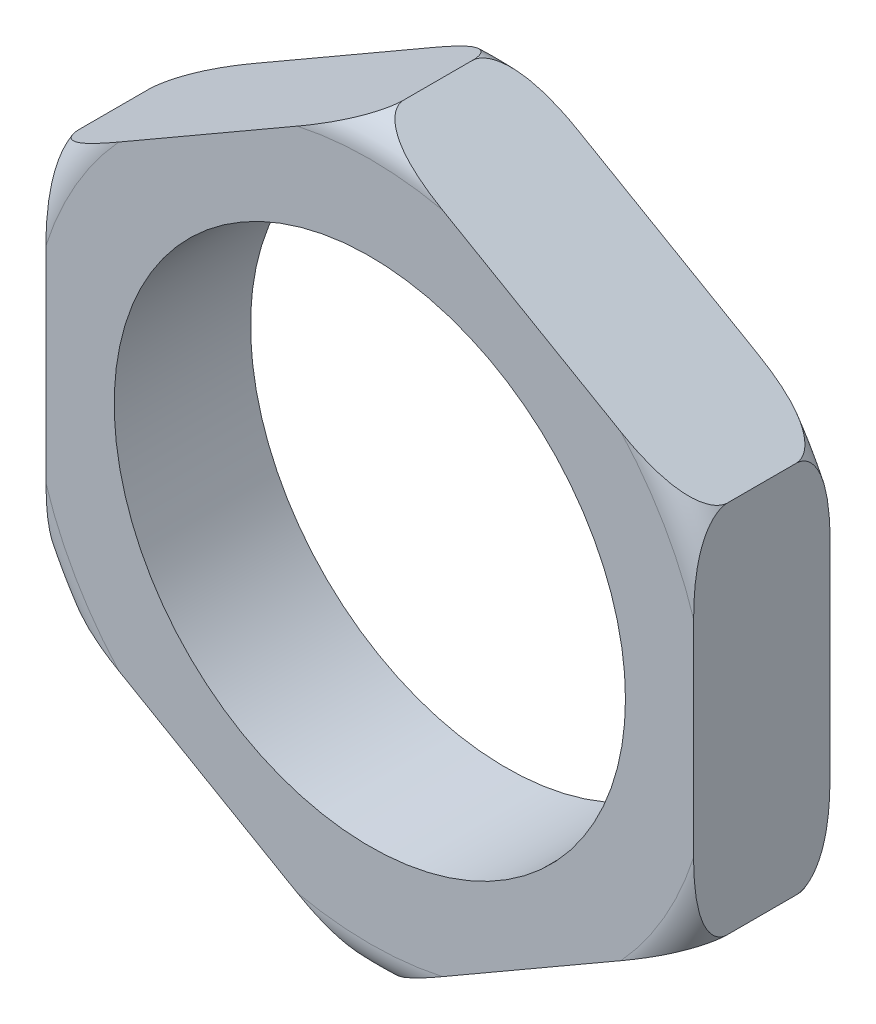
ISO-10303-21;
HEADER;
FILE_DESCRIPTION(('STEP AP214'),'2;1');
FILE_NAME('part.step','',(''),(''),'','','');
FILE_SCHEMA(('AUTOMOTIVE_DESIGN { 1 0 10303 214 1 1 1 1 }'));
ENDSEC;
DATA;
#1=APPLICATION_CONTEXT('core data for automotive mechanical design processes');
#2=APPLICATION_PROTOCOL_DEFINITION('international standard','automotive_design',2000,#1);
#3=PRODUCT_CONTEXT('',#1,'mechanical');
#4=PRODUCT('Part','Part','',(#3));
#5=PRODUCT_RELATED_PRODUCT_CATEGORY('part','',(#4));
#6=PRODUCT_DEFINITION_FORMATION('','',#4);
#7=PRODUCT_DEFINITION_CONTEXT('part definition',#1,'design');
#8=PRODUCT_DEFINITION('design','',#6,#7);
#9=PRODUCT_DEFINITION_SHAPE('','',#8);
#10=(LENGTH_UNIT() NAMED_UNIT(*) SI_UNIT(.MILLI.,.METRE.));
#11=(NAMED_UNIT(*) PLANE_ANGLE_UNIT() SI_UNIT($,.RADIAN.));
#12=(NAMED_UNIT(*) SI_UNIT($,.STERADIAN.) SOLID_ANGLE_UNIT());
#13=UNCERTAINTY_MEASURE_WITH_UNIT(LENGTH_MEASURE(1.E-05),#10,'distance_accuracy_value','');
#14=(GEOMETRIC_REPRESENTATION_CONTEXT(3) GLOBAL_UNCERTAINTY_ASSIGNED_CONTEXT((#13)) GLOBAL_UNIT_ASSIGNED_CONTEXT((#10,
#11,#12)) REPRESENTATION_CONTEXT('',''));
#15=CARTESIAN_POINT('',(0.,0.,0.));
#16=DIRECTION('',(0.,0.,1.));
#17=DIRECTION('',(1.,0.,0.));
#18=AXIS2_PLACEMENT_3D('',#15,#16,#17);
#19=CARTESIAN_POINT('',(0.,0.,15.5));
#20=DIRECTION('',(0.,0.,1.));
#21=DIRECTION('',(1.,0.,0.));
#22=AXIS2_PLACEMENT_3D('',#19,#20,#21);
#23=TOROIDAL_SURFACE('',#22,9.96965511460289,1.);
#24=CARTESIAN_POINT('',(9.5,3.02390858064981,14.5));
#25=CARTESIAN_POINT('',(9.5,3.88125681093695,14.5));
#26=CARTESIAN_POINT('',(9.5,4.44614894833069,14.6454097553584));
#27=CARTESIAN_POINT('',(9.5,4.84647059494945,14.7484571671493));
#28=CARTESIAN_POINT('',(9.5,5.10555316569901,14.9210536820706));
#29=CARTESIAN_POINT('',(9.5,5.27201082232685,15.0319450142541));
#30=CARTESIAN_POINT('',(9.5,5.36829139169409,15.1649452077994));
#31=CARTESIAN_POINT('',(9.5,5.48482755730145,15.3259261064653));
#32=CARTESIAN_POINT('',(9.5,5.48482755730145,15.5));
#33=B_SPLINE_CURVE_WITH_KNOTS('',2,(#24,#25,#26,#27,#28,#29,#30,#31,#32),.UNSPECIFIED.,.F.,.F.,
(3,2,2,2,3),(0.,0.5,0.75,0.875,1.),.UNSPECIFIED.);
#34=CARTESIAN_POINT('',(9.5,3.02390858064981,14.5));
#35=VERTEX_POINT('',#34);
#36=CARTESIAN_POINT('',(9.5,5.48482755730145,15.5));
#37=VERTEX_POINT('',#36);
#38=EDGE_CURVE('E506',#35,#37,#33,.T.);
#39=ORIENTED_EDGE('',*,*,#38,.F.);
#40=CARTESIAN_POINT('',(0.,0.,14.5));
#41=DIRECTION('',(0.,0.,1.));
#42=DIRECTION('',(1.,0.,0.));
#43=AXIS2_PLACEMENT_3D('',#40,#41,#42);
#44=CIRCLE('',#43,9.96965511460289);
#45=CARTESIAN_POINT('',(7.36878164956448,6.71528704562726,14.5));
#46=VERTEX_POINT('',#45);
#47=EDGE_CURVE('E651',#35,#46,#44,.T.);
#48=ORIENTED_EDGE('',*,*,#47,.T.);
#49=CARTESIAN_POINT('',(9.5,5.48482755730145,15.5));
#50=CARTESIAN_POINT('',(9.5,5.48482755730145,15.3253370413453));
#51=CARTESIAN_POINT('',(9.39786028269859,5.54379795058037,15.1630084843388));
#52=CARTESIAN_POINT('',(9.31453432809328,5.59190621290223,15.0305802543649));
#53=CARTESIAN_POINT('',(9.16885617377053,5.67601353451551,14.9189945151217));
#54=CARTESIAN_POINT('',(8.94447002387213,5.80556293856178,14.7471204648994));
#55=CARTESIAN_POINT('',(8.59618172343557,6.00664728257443,14.6441360537618));
#56=CARTESIAN_POINT('',(8.1087205568202,6.2880831183393,14.5));
#57=CARTESIAN_POINT('',(7.36878164956448,6.71528704562727,14.5));
#58=B_SPLINE_CURVE_WITH_KNOTS('',2,(#49,#50,#51,#52,#53,#54,#55,#56,#57),.UNSPECIFIED.,.F.,.F.,
(3,2,2,2,3),(0.,0.125,0.25,0.5,1.),.UNSPECIFIED.);
#59=EDGE_CURVE('E635',#37,#46,#58,.T.);
#60=ORIENTED_EDGE('',*,*,#59,.F.);
#61=EDGE_LOOP('',(#39,#48,#60));
#62=FACE_BOUND('',#61,.T.);
#63=ADVANCED_FACE('F16',(#62),#23,.T.);
#64=CARTESIAN_POINT('',(0.,0.,15.5));
#65=DIRECTION('',(0.,0.,1.));
#66=DIRECTION('',(1.,0.,0.));
#67=AXIS2_PLACEMENT_3D('',#64,#65,#66);
#68=TOROIDAL_SURFACE('',#67,9.96965511460289,1.);
#69=CARTESIAN_POINT('',(0.,0.,14.5));
#70=DIRECTION('',(0.,0.,1.));
#71=DIRECTION('',(1.,0.,0.));
#72=AXIS2_PLACEMENT_3D('',#69,#70,#71);
#73=CIRCLE('',#72,9.96965511460289);
#74=CARTESIAN_POINT('',(2.13121835043552,9.73919562627708,14.5));
#75=VERTEX_POINT('',#74);
#76=CARTESIAN_POINT('',(-2.13121835043552,9.73919562627708,14.5));
#77=VERTEX_POINT('',#76);
#78=EDGE_CURVE('E11',#75,#77,#73,.T.);
#79=ORIENTED_EDGE('',*,*,#78,.T.);
#80=CARTESIAN_POINT('',(0.,10.9696551146029,15.5));
#81=CARTESIAN_POINT('',(0.,10.9696551146029,15.3253370413446));
#82=CARTESIAN_POINT('',(-0.102139717301413,10.910684721324,15.1630084843389));
#83=CARTESIAN_POINT('',(-0.185465671907815,10.8625764590015,15.0305802543638));
#84=CARTESIAN_POINT('',(-0.331143826229461,10.7784691373888,14.9189945151217));
#85=CARTESIAN_POINT('',(-0.555529976128738,10.6489197333421,14.7471204648992));
#86=CARTESIAN_POINT('',(-0.903818276564435,10.4478353893299,14.6441360537618));
#87=CARTESIAN_POINT('',(-1.3912794431798,10.166399553565,14.5));
#88=CARTESIAN_POINT('',(-2.13121835043552,9.73919562627708,14.5));
#89=B_SPLINE_CURVE_WITH_KNOTS('',2,(#80,#81,#82,#83,#84,#85,#86,#87,#88),.UNSPECIFIED.,.F.,.F.,
(3,2,2,2,3),(0.,0.125,0.25,0.5,1.),.UNSPECIFIED.);
#90=CARTESIAN_POINT('',(0.,10.9696551146029,15.5));
#91=VERTEX_POINT('',#90);
#92=EDGE_CURVE('E207',#91,#77,#89,.T.);
#93=ORIENTED_EDGE('',*,*,#92,.F.);
#94=CARTESIAN_POINT('',(2.13121835043551,9.73919562627708,14.5));
#95=CARTESIAN_POINT('',(1.38867704383297,10.1679020495285,14.5));
#96=CARTESIAN_POINT('',(0.899457568548213,10.4503530452769,14.6454289384569));
#97=CARTESIAN_POINT('',(0.552712319350637,10.6505465082414,14.7485049525024));
#98=CARTESIAN_POINT('',(0.328351412116601,10.7800813384286,14.9211382569751));
#99=CARTESIAN_POINT('',(0.184382073950813,10.8632020745736,15.0319146970275));
#100=CARTESIAN_POINT('',(0.101063566289547,10.9113060374004,15.1647211909555));
#101=CARTESIAN_POINT('',(0.,10.9696551146029,15.3258126252541));
#102=CARTESIAN_POINT('',(0.,10.9696551146029,15.5));
#103=B_SPLINE_CURVE_WITH_KNOTS('',2,(#94,#95,#96,#97,#98,#99,#100,#101,#102),.UNSPECIFIED.,.F.,
.F.,(3,2,2,2,3),(0.,0.5,0.75,0.875,1.),.UNSPECIFIED.);
#104=EDGE_CURVE('E208',#75,#91,#103,.T.);
#105=ORIENTED_EDGE('',*,*,#104,.F.);
#106=EDGE_LOOP('',(#79,#93,#105));
#107=FACE_BOUND('',#106,.T.);
#108=ADVANCED_FACE('F203',(#107),#68,.T.);
#109=CARTESIAN_POINT('',(0.,0.,15.5));
#110=DIRECTION('',(0.,0.,1.));
#111=DIRECTION('',(1.,0.,0.));
#112=AXIS2_PLACEMENT_3D('',#109,#110,#111);
#113=TOROIDAL_SURFACE('',#112,9.96965511460289,1.);
#114=CARTESIAN_POINT('',(-7.36878164956449,6.71528704562727,14.5));
#115=CARTESIAN_POINT('',(-8.11132295616296,6.28658062237822,14.5));
#116=CARTESIAN_POINT('',(-8.60054243145179,6.00412962662741,14.6454289384569));
#117=CARTESIAN_POINT('',(-8.94728768064789,5.80393616366382,14.7485049525011));
#118=CARTESIAN_POINT('',(-9.17164858788341,5.67440133347576,14.9211382569751));
#119=CARTESIAN_POINT('',(-9.31561792604912,5.59128059733074,15.0319146970275));
#120=CARTESIAN_POINT('',(-9.39893643371045,5.54317663450399,15.1647211909555));
#121=CARTESIAN_POINT('',(-9.50000000000001,5.48482755730145,15.3258126252539));
#122=CARTESIAN_POINT('',(-9.50000000000001,5.48482755730145,15.5));
#123=B_SPLINE_CURVE_WITH_KNOTS('',2,(#114,#115,#116,#117,#118,#119,#120,#121,#122),
.UNSPECIFIED.,.F.,.F.,(3,2,2,2,3),(0.,0.5,0.75,0.875,1.),.UNSPECIFIED.);
#124=CARTESIAN_POINT('',(-7.36878164956448,6.71528704562726,14.5));
#125=VERTEX_POINT('',#124);
#126=CARTESIAN_POINT('',(-9.5,5.48482755730144,15.5));
#127=VERTEX_POINT('',#126);
#128=EDGE_CURVE('E219',#125,#127,#123,.T.);
#129=ORIENTED_EDGE('',*,*,#128,.F.);
#130=CARTESIAN_POINT('',(0.,0.,14.5));
#131=DIRECTION('',(0.,0.,1.));
#132=DIRECTION('',(1.,0.,0.));
#133=AXIS2_PLACEMENT_3D('',#130,#131,#132);
#134=CIRCLE('',#133,9.96965511460289);
#135=CARTESIAN_POINT('',(-9.5,3.0239085806498,14.5));
#136=VERTEX_POINT('',#135);
#137=EDGE_CURVE('E28',#125,#136,#134,.T.);
#138=ORIENTED_EDGE('',*,*,#137,.T.);
#139=CARTESIAN_POINT('',(-9.5,5.48482755730144,15.5));
#140=CARTESIAN_POINT('',(-9.5,5.48482755730144,15.3253112254228));
#141=CARTESIAN_POINT('',(-9.5,5.3668455599649,15.1629518571871));
#142=CARTESIAN_POINT('',(-9.5,5.27060561545487,15.0305125279466));
#143=CARTESIAN_POINT('',(-9.5,5.10232945936502,14.918910912195));
#144=CARTESIAN_POINT('',(-9.5,4.84280265604622,14.746791395953));
#145=CARTESIAN_POINT('',(-9.5,4.43979630969014,14.6437801842526));
#146=CARTESIAN_POINT('',(-9.5,3.87729126021449,14.5));
#147=CARTESIAN_POINT('',(-9.5,3.0239085806498,14.5));
#148=B_SPLINE_CURVE_WITH_KNOTS('',2,(#139,#140,#141,#142,#143,#144,#145,#146,#147),
.UNSPECIFIED.,.F.,.F.,(3,2,2,2,3),(0.,0.125,0.25,0.5,1.),.UNSPECIFIED.);
#149=EDGE_CURVE('E226',#127,#136,#148,.T.);
#150=ORIENTED_EDGE('',*,*,#149,.F.);
#151=EDGE_LOOP('',(#129,#138,#150));
#152=FACE_BOUND('',#151,.T.);
#153=ADVANCED_FACE('F281',(#152),#113,.T.);
#154=CARTESIAN_POINT('',(0.,0.,15.5));
#155=DIRECTION('',(0.,0.,1.));
#156=DIRECTION('',(1.,0.,0.));
#157=AXIS2_PLACEMENT_3D('',#154,#155,#156);
#158=TOROIDAL_SURFACE('',#157,9.96965511460289,1.);
#159=CARTESIAN_POINT('',(-9.5,-3.0239085806498,14.5));
#160=CARTESIAN_POINT('',(-9.5,-3.88125681093334,14.5));
#161=CARTESIAN_POINT('',(-9.5,-4.44614894833069,14.6454097553584));
#162=CARTESIAN_POINT('',(-9.5,-4.84647059494784,14.7484571671483));
#163=CARTESIAN_POINT('',(-9.5,-5.105553165699,14.9210536820706));
#164=CARTESIAN_POINT('',(-9.5,-5.27201082232438,15.0319450142524));
#165=CARTESIAN_POINT('',(-9.5,-5.3682913916941,15.1649452077994));
#166=CARTESIAN_POINT('',(-9.5,-5.48482755730144,15.3259261064632));
#167=CARTESIAN_POINT('',(-9.5,-5.48482755730144,15.5));
#168=B_SPLINE_CURVE_WITH_KNOTS('',2,(#159,#160,#161,#162,#163,#164,#165,#166,#167),
.UNSPECIFIED.,.F.,.F.,(3,2,2,2,3),(0.,0.5,0.75,0.875,1.),.UNSPECIFIED.);
#169=CARTESIAN_POINT('',(-9.5,-3.0239085806498,14.5));
#170=VERTEX_POINT('',#169);
#171=CARTESIAN_POINT('',(-9.5,-5.48482755730144,15.5));
#172=VERTEX_POINT('',#171);
#173=EDGE_CURVE('E311',#170,#172,#168,.T.);
#174=ORIENTED_EDGE('',*,*,#173,.F.);
#175=CARTESIAN_POINT('',(0.,0.,14.5));
#176=DIRECTION('',(0.,0.,1.));
#177=DIRECTION('',(1.,0.,0.));
#178=AXIS2_PLACEMENT_3D('',#175,#176,#177);
#179=CIRCLE('',#178,9.96965511460289);
#180=CARTESIAN_POINT('',(-7.36878164956448,-6.71528704562726,14.5));
#181=VERTEX_POINT('',#180);
#182=EDGE_CURVE('E397',#170,#181,#179,.T.);
#183=ORIENTED_EDGE('',*,*,#182,.T.);
#184=CARTESIAN_POINT('',(-9.5,-5.48482755730145,15.5));
#185=CARTESIAN_POINT('',(-9.5,-5.48482755730145,15.3253370413459));
#186=CARTESIAN_POINT('',(-9.39786028269858,-5.54379795058037,15.1630084843389));
#187=CARTESIAN_POINT('',(-9.31453432809358,-5.59190621290206,15.0305802543649));
#188=CARTESIAN_POINT('',(-9.16885617377054,-5.67601353451551,14.9189945151217));
#189=CARTESIAN_POINT('',(-8.94447002387042,-5.80556293856277,14.7471204648984));
#190=CARTESIAN_POINT('',(-8.59618172343557,-6.00664728257443,14.6441360537618));
#191=CARTESIAN_POINT('',(-8.10872055681786,-6.28808311834065,14.5));
#192=CARTESIAN_POINT('',(-7.36878164956448,-6.71528704562727,14.5));
#193=B_SPLINE_CURVE_WITH_KNOTS('',2,(#184,#185,#186,#187,#188,#189,#190,#191,#192),
.UNSPECIFIED.,.F.,.F.,(3,2,2,2,3),(0.,0.125,0.25,0.5,1.),.UNSPECIFIED.);
#194=EDGE_CURVE('E374',#172,#181,#193,.T.);
#195=ORIENTED_EDGE('',*,*,#194,.F.);
#196=EDGE_LOOP('',(#174,#183,#195));
#197=FACE_BOUND('',#196,.T.);
#198=ADVANCED_FACE('F291',(#197),#158,.T.);
#199=CARTESIAN_POINT('',(0.,0.,15.5));
#200=DIRECTION('',(0.,0.,1.));
#201=DIRECTION('',(1.,0.,0.));
#202=AXIS2_PLACEMENT_3D('',#199,#200,#201);
#203=TOROIDAL_SURFACE('',#202,9.96965511460289,1.);
#204=CARTESIAN_POINT('',(-2.13121835043551,-9.73919562627708,14.5));
#205=CARTESIAN_POINT('',(-1.3886770438338,-10.167902049528,14.5));
#206=CARTESIAN_POINT('',(-0.899457568548213,-10.4503530452769,14.6454289384569));
#207=CARTESIAN_POINT('',(-0.552712319351381,-10.650546508241,14.748504952502));
#208=CARTESIAN_POINT('',(-0.328351412116583,-10.7800813384286,14.9211382569751));
#209=CARTESIAN_POINT('',(-0.184382073951019,-10.8632020745735,15.0319146970272));
#210=CARTESIAN_POINT('',(-0.101063566289547,-10.9113060374004,15.1647211909555));
#211=CARTESIAN_POINT('',(0.,-10.9696551146029,15.325812625254));
#212=CARTESIAN_POINT('',(0.,-10.9696551146029,15.5));
#213=B_SPLINE_CURVE_WITH_KNOTS('',2,(#204,#205,#206,#207,#208,#209,#210,#211,#212),
.UNSPECIFIED.,.F.,.F.,(3,2,2,2,3),(0.,0.5,0.75,0.875,1.),.UNSPECIFIED.);
#214=CARTESIAN_POINT('',(-2.13121835043552,-9.73919562627708,14.5));
#215=VERTEX_POINT('',#214);
#216=CARTESIAN_POINT('',(0.,-10.9696551146029,15.5));
#217=VERTEX_POINT('',#216);
#218=EDGE_CURVE('E767',#215,#217,#213,.T.);
#219=ORIENTED_EDGE('',*,*,#218,.F.);
#220=CARTESIAN_POINT('',(0.,0.,14.5));
#221=DIRECTION('',(0.,0.,1.));
#222=DIRECTION('',(1.,0.,0.));
#223=AXIS2_PLACEMENT_3D('',#220,#221,#222);
#224=CIRCLE('',#223,9.96965511460289);
#225=CARTESIAN_POINT('',(2.13121835043551,-9.73919562627708,14.5));
#226=VERTEX_POINT('',#225);
#227=EDGE_CURVE('E754',#215,#226,#224,.T.);
#228=ORIENTED_EDGE('',*,*,#227,.T.);
#229=CARTESIAN_POINT('',(0.,-10.9696551146029,15.5));
#230=CARTESIAN_POINT('',(0.,-10.9696551146029,15.3253370413451));
#231=CARTESIAN_POINT('',(0.102139717301412,-10.910684721324,15.1630084843389));
#232=CARTESIAN_POINT('',(0.185465671906778,-10.8625764590021,15.030580254365));
#233=CARTESIAN_POINT('',(0.33114382622946,-10.7784691373888,14.9189945151217));
#234=CARTESIAN_POINT('',(0.555529976128196,-10.6489197333424,14.7471204648989));
#235=CARTESIAN_POINT('',(0.903818276564432,-10.4478353893299,14.6441360537618));
#236=CARTESIAN_POINT('',(1.39127944318193,-10.1663995535638,14.5));
#237=CARTESIAN_POINT('',(2.13121835043552,-9.73919562627708,14.5));
#238=B_SPLINE_CURVE_WITH_KNOTS('',2,(#229,#230,#231,#232,#233,#234,#235,#236,#237),
.UNSPECIFIED.,.F.,.F.,(3,2,2,2,3),(0.,0.125,0.25,0.5,1.),.UNSPECIFIED.);
#239=EDGE_CURVE('E784',#217,#226,#238,.T.);
#240=ORIENTED_EDGE('',*,*,#239,.F.);
#241=EDGE_LOOP('',(#219,#228,#240));
#242=FACE_BOUND('',#241,.T.);
#243=ADVANCED_FACE('F411',(#242),#203,.T.);
#244=CARTESIAN_POINT('',(0.,0.,15.5));
#245=DIRECTION('',(0.,0.,1.));
#246=DIRECTION('',(1.,0.,0.));
#247=AXIS2_PLACEMENT_3D('',#244,#245,#246);
#248=TOROIDAL_SURFACE('',#247,9.96965511460289,1.);
#249=CARTESIAN_POINT('',(7.36878164956448,-6.71528704562727,14.5));
#250=CARTESIAN_POINT('',(8.11132295616945,-6.28658062237448,14.5));
#251=CARTESIAN_POINT('',(8.60054243145179,-6.00412962662741,14.6454289384569));
#252=CARTESIAN_POINT('',(8.94728768064863,-5.80393616366339,14.7485049525027));
#253=CARTESIAN_POINT('',(9.17164858788341,-5.67440133347576,14.9211382569751));
#254=CARTESIAN_POINT('',(9.31561792604801,-5.59128059733138,15.031914697026));
#255=CARTESIAN_POINT('',(9.39893643371047,-5.54317663450398,15.1647211909555));
#256=CARTESIAN_POINT('',(9.50000000000001,-5.48482755730145,15.3258126252536));
#257=CARTESIAN_POINT('',(9.50000000000001,-5.48482755730145,15.5));
#258=B_SPLINE_CURVE_WITH_KNOTS('',2,(#249,#250,#251,#252,#253,#254,#255,#256,#257),
.UNSPECIFIED.,.F.,.F.,(3,2,2,2,3),(0.,0.5,0.75,0.875,1.),.UNSPECIFIED.);
#259=CARTESIAN_POINT('',(7.36878164956448,-6.71528704562726,14.5));
#260=VERTEX_POINT('',#259);
#261=CARTESIAN_POINT('',(9.5,-5.48482755730144,15.5));
#262=VERTEX_POINT('',#261);
#263=EDGE_CURVE('E474',#260,#262,#258,.T.);
#264=ORIENTED_EDGE('',*,*,#263,.F.);
#265=CARTESIAN_POINT('',(0.,0.,14.5));
#266=DIRECTION('',(0.,0.,1.));
#267=DIRECTION('',(1.,0.,0.));
#268=AXIS2_PLACEMENT_3D('',#265,#266,#267);
#269=CIRCLE('',#268,9.96965511460289);
#270=CARTESIAN_POINT('',(9.5,-3.02390858064981,14.5));
#271=VERTEX_POINT('',#270);
#272=EDGE_CURVE('E478',#260,#271,#269,.T.);
#273=ORIENTED_EDGE('',*,*,#272,.T.);
#274=CARTESIAN_POINT('',(9.5,-5.48482755730145,15.5));
#275=CARTESIAN_POINT('',(9.5,-5.48482755730145,15.3253112254239));
#276=CARTESIAN_POINT('',(9.5,-5.36684555996492,15.1629518571871));
#277=CARTESIAN_POINT('',(9.5,-5.27060561545521,15.0305125279462));
#278=CARTESIAN_POINT('',(9.5,-5.10232945936504,14.918910912195));
#279=CARTESIAN_POINT('',(9.5,-4.84280265604369,14.7467913959524));
#280=CARTESIAN_POINT('',(9.5,-4.43979630969014,14.6437801842526));
#281=CARTESIAN_POINT('',(9.5,-3.87729126021451,14.5));
#282=CARTESIAN_POINT('',(9.5,-3.02390858064982,14.5));
#283=B_SPLINE_CURVE_WITH_KNOTS('',2,(#274,#275,#276,#277,#278,#279,#280,#281,#282),
.UNSPECIFIED.,.F.,.F.,(3,2,2,2,3),(0.,0.125,0.25,0.5,1.),.UNSPECIFIED.);
#284=EDGE_CURVE('E873',#262,#271,#283,.T.);
#285=ORIENTED_EDGE('',*,*,#284,.F.);
#286=EDGE_LOOP('',(#264,#273,#285));
#287=FACE_BOUND('',#286,.T.);
#288=ADVANCED_FACE('F482',(#287),#248,.T.);
#289=CARTESIAN_POINT('',(0.,0.,17.5));
#290=DIRECTION('',(0.,0.,1.));
#291=DIRECTION('',(1.,0.,0.));
#292=AXIS2_PLACEMENT_3D('',#289,#290,#291);
#293=TOROIDAL_SURFACE('',#292,9.96965511460289,1.);
#294=CARTESIAN_POINT('',(0.,0.,18.5));
#295=DIRECTION('',(0.,0.,1.));
#296=DIRECTION('',(1.,0.,0.));
#297=AXIS2_PLACEMENT_3D('',#294,#295,#296);
#298=CIRCLE('',#297,9.96965511460289);
#299=CARTESIAN_POINT('',(9.5,3.02390858064981,18.5));
#300=VERTEX_POINT('',#299);
#301=CARTESIAN_POINT('',(7.36878164956448,6.71528704562726,18.5));
#302=VERTEX_POINT('',#301);
#303=EDGE_CURVE('E674',#300,#302,#298,.T.);
#304=ORIENTED_EDGE('',*,*,#303,.F.);
#305=CARTESIAN_POINT('',(9.5,5.48482755730145,17.5));
#306=CARTESIAN_POINT('',(9.5,5.48482755730145,17.6746887745774));
#307=CARTESIAN_POINT('',(9.5,5.36684555996491,17.8370481428129));
#308=CARTESIAN_POINT('',(9.5,5.27060561545459,17.9694874720535));
#309=CARTESIAN_POINT('',(9.5,5.10232945936503,18.081089087805));
#310=CARTESIAN_POINT('',(9.5,4.84280265604451,18.2532086040481));
#311=CARTESIAN_POINT('',(9.5,4.43979630969013,18.3562198157474));
#312=CARTESIAN_POINT('',(9.5,3.87729126021072,18.5));
#313=CARTESIAN_POINT('',(9.5,3.02390858064981,18.5));
#314=B_SPLINE_CURVE_WITH_KNOTS('',2,(#305,#306,#307,#308,#309,#310,#311,#312,#313),
.UNSPECIFIED.,.F.,.F.,(3,2,2,2,3),(0.,0.125,0.25,0.5,1.),.UNSPECIFIED.);
#315=CARTESIAN_POINT('',(9.5,5.48482755730145,17.5));
#316=VERTEX_POINT('',#315);
#317=EDGE_CURVE('E542',#316,#300,#314,.T.);
#318=ORIENTED_EDGE('',*,*,#317,.F.);
#319=CARTESIAN_POINT('',(7.36878164956448,6.71528704562727,18.5));
#320=CARTESIAN_POINT('',(8.11132295617668,6.2865806223703,18.5));
#321=CARTESIAN_POINT('',(8.60054243145178,6.00412962662741,18.3545710615431));
#322=CARTESIAN_POINT('',(8.94728768065096,5.80393616366204,18.2514950474951));
#323=CARTESIAN_POINT('',(9.1716485878834,5.67440133347576,18.0788617430249));
#324=CARTESIAN_POINT('',(9.31561792604907,5.59128059733076,17.9680853029734));
#325=CARTESIAN_POINT('',(9.39893643371046,5.54317663450398,17.8352788090445));
#326=CARTESIAN_POINT('',(9.5,5.48482755730145,17.674187374745));
#327=CARTESIAN_POINT('',(9.5,5.48482755730145,17.5));
#328=B_SPLINE_CURVE_WITH_KNOTS('',2,(#319,#320,#321,#322,#323,#324,#325,#326,#327),
.UNSPECIFIED.,.F.,.F.,(3,2,2,2,3),(0.,0.5,0.75,0.875,1.),.UNSPECIFIED.);
#329=EDGE_CURVE('E508',#302,#316,#328,.T.);
#330=ORIENTED_EDGE('',*,*,#329,.F.);
#331=EDGE_LOOP('',(#304,#318,#330));
#332=FACE_BOUND('',#331,.T.);
#333=ADVANCED_FACE('F486',(#332),#293,.T.);
#334=CARTESIAN_POINT('',(0.,0.,17.5));
#335=DIRECTION('',(0.,0.,1.));
#336=DIRECTION('',(1.,0.,0.));
#337=AXIS2_PLACEMENT_3D('',#334,#335,#336);
#338=TOROIDAL_SURFACE('',#337,9.96965511460289,1.);
#339=CARTESIAN_POINT('',(-2.13121835043552,9.73919562627708,18.5));
#340=CARTESIAN_POINT('',(-1.38867704382415,10.1679020495336,18.5));
#341=CARTESIAN_POINT('',(-0.899457568548217,10.4503530452769,18.3545710615431));
#342=CARTESIAN_POINT('',(-0.552712319349865,10.6505465082418,18.2514950474955));
#343=CARTESIAN_POINT('',(-0.328351412116588,10.7800813384286,18.0788617430249));
#344=CARTESIAN_POINT('',(-0.184382073952914,10.8632020745724,17.9680853029751));
#345=CARTESIAN_POINT('',(-0.101063566289545,10.9113060374004,17.8352788090445));
#346=CARTESIAN_POINT('',(0.,10.9696551146029,17.6741873747469));
#347=CARTESIAN_POINT('',(0.,10.9696551146029,17.5));
#348=B_SPLINE_CURVE_WITH_KNOTS('',2,(#339,#340,#341,#342,#343,#344,#345,#346,#347),
.UNSPECIFIED.,.F.,.F.,(3,2,2,2,3),(0.,0.5,0.75,0.875,1.),.UNSPECIFIED.);
#349=CARTESIAN_POINT('',(-2.13121835043552,9.73919562627708,18.5));
#350=VERTEX_POINT('',#349);
#351=CARTESIAN_POINT('',(0.,10.9696551146029,17.5));
#352=VERTEX_POINT('',#351);
#353=EDGE_CURVE('E675',#350,#352,#348,.T.);
#354=ORIENTED_EDGE('',*,*,#353,.F.);
#355=CARTESIAN_POINT('',(0.,0.,18.5));
#356=DIRECTION('',(0.,0.,1.));
#357=DIRECTION('',(1.,0.,0.));
#358=AXIS2_PLACEMENT_3D('',#355,#356,#357);
#359=CIRCLE('',#358,9.96965511460289);
#360=CARTESIAN_POINT('',(2.13121835043552,9.73919562627708,18.5));
#361=VERTEX_POINT('',#360);
#362=EDGE_CURVE('E44',#361,#350,#359,.T.);
#363=ORIENTED_EDGE('',*,*,#362,.F.);
#364=CARTESIAN_POINT('',(0.,10.9696551146029,17.5));
#365=CARTESIAN_POINT('',(0.,10.9696551146029,17.6746629586553));
#366=CARTESIAN_POINT('',(0.102139717301412,10.910684721324,17.8369915156611));
#367=CARTESIAN_POINT('',(0.185465671906138,10.8625764590024,17.9694197456337));
#368=CARTESIAN_POINT('',(0.331143826229462,10.7784691373888,18.0810054848783));
#369=CARTESIAN_POINT('',(0.555529976128063,10.6489197333424,18.2528795351023));
#370=CARTESIAN_POINT('',(0.90381827656443,10.4478353893299,18.3558639462382));
#371=CARTESIAN_POINT('',(1.39127944318768,10.1663995535605,18.5));
#372=CARTESIAN_POINT('',(2.13121835043551,9.73919562627708,18.5));
#373=B_SPLINE_CURVE_WITH_KNOTS('',2,(#364,#365,#366,#367,#368,#369,#370,#371,#372),
.UNSPECIFIED.,.F.,.F.,(3,2,2,2,3),(0.,0.125,0.25,0.5,1.),.UNSPECIFIED.);
#374=EDGE_CURVE('E588',#352,#361,#373,.T.);
#375=ORIENTED_EDGE('',*,*,#374,.F.);
#376=EDGE_LOOP('',(#354,#363,#375));
#377=FACE_BOUND('',#376,.T.);
#378=ADVANCED_FACE('F248',(#377),#338,.T.);
#379=CARTESIAN_POINT('',(0.,0.,17.5));
#380=DIRECTION('',(0.,0.,1.));
#381=DIRECTION('',(1.,0.,0.));
#382=AXIS2_PLACEMENT_3D('',#379,#380,#381);
#383=TOROIDAL_SURFACE('',#382,9.96965511460289,1.);
#384=CARTESIAN_POINT('',(0.,0.,18.5));
#385=DIRECTION('',(0.,0.,1.));
#386=DIRECTION('',(1.,0.,0.));
#387=AXIS2_PLACEMENT_3D('',#384,#385,#386);
#388=CIRCLE('',#387,9.96965511460289);
#389=CARTESIAN_POINT('',(-7.36878164956448,6.71528704562726,18.5));
#390=VERTEX_POINT('',#389);
#391=CARTESIAN_POINT('',(-9.5,3.0239085806498,18.5));
#392=VERTEX_POINT('',#391);
#393=EDGE_CURVE('E104',#390,#392,#388,.T.);
#394=ORIENTED_EDGE('',*,*,#393,.F.);
#395=CARTESIAN_POINT('',(-9.50000000000001,5.48482755730145,17.5));
#396=CARTESIAN_POINT('',(-9.50000000000001,5.48482755730145,17.6746629586538));
#397=CARTESIAN_POINT('',(-9.39786028269859,5.54379795058038,17.8369915156612));
#398=CARTESIAN_POINT('',(-9.3145343280953,5.59190621290107,17.9694197456326));
#399=CARTESIAN_POINT('',(-9.16885617377054,5.67601353451552,18.0810054848783));
#400=CARTESIAN_POINT('',(-8.94447002387485,5.80556293856022,18.2528795351001));
#401=CARTESIAN_POINT('',(-8.59618172343558,6.00664728257443,18.3558639462382));
#402=CARTESIAN_POINT('',(-8.10872055681875,6.28808311834014,18.5));
#403=CARTESIAN_POINT('',(-7.36878164956449,6.71528704562727,18.5));
#404=B_SPLINE_CURVE_WITH_KNOTS('',2,(#395,#396,#397,#398,#399,#400,#401,#402,#403),
.UNSPECIFIED.,.F.,.F.,(3,2,2,2,3),(0.,0.125,0.25,0.5,1.),.UNSPECIFIED.);
#405=CARTESIAN_POINT('',(-9.5,5.48482755730145,17.5));
#406=VERTEX_POINT('',#405);
#407=EDGE_CURVE('E685',#406,#390,#404,.T.);
#408=ORIENTED_EDGE('',*,*,#407,.F.);
#409=CARTESIAN_POINT('',(-9.5,3.0239085806498,18.5));
#410=CARTESIAN_POINT('',(-9.5,3.88125681094698,18.5));
#411=CARTESIAN_POINT('',(-9.5,4.44614894833069,18.3545902446416));
#412=CARTESIAN_POINT('',(-9.5,4.84647059495556,18.2515428328473));
#413=CARTESIAN_POINT('',(-9.5,5.10555316569901,18.0789463179294));
#414=CARTESIAN_POINT('',(-9.5,5.27201082232662,17.9680549857457));
#415=CARTESIAN_POINT('',(-9.5,5.3682913916941,17.8350547922006));
#416=CARTESIAN_POINT('',(-9.5,5.48482755730144,17.6740738935354));
#417=CARTESIAN_POINT('',(-9.5,5.48482755730144,17.5));
#418=B_SPLINE_CURVE_WITH_KNOTS('',2,(#409,#410,#411,#412,#413,#414,#415,#416,#417),
.UNSPECIFIED.,.F.,.F.,(3,2,2,2,3),(0.,0.5,0.75,0.875,1.),.UNSPECIFIED.);
#419=EDGE_CURVE('E321',#392,#406,#418,.T.);
#420=ORIENTED_EDGE('',*,*,#419,.F.);
#421=EDGE_LOOP('',(#394,#408,#420));
#422=FACE_BOUND('',#421,.T.);
#423=ADVANCED_FACE('F340',(#422),#383,.T.);
#424=CARTESIAN_POINT('',(0.,0.,17.5));
#425=DIRECTION('',(0.,0.,1.));
#426=DIRECTION('',(1.,0.,0.));
#427=AXIS2_PLACEMENT_3D('',#424,#425,#426);
#428=TOROIDAL_SURFACE('',#427,9.96965511460289,1.);
#429=CARTESIAN_POINT('',(0.,0.,18.5));
#430=DIRECTION('',(0.,0.,1.));
#431=DIRECTION('',(1.,0.,0.));
#432=AXIS2_PLACEMENT_3D('',#429,#430,#431);
#433=CIRCLE('',#432,9.96965511460289);
#434=CARTESIAN_POINT('',(-9.5,-3.0239085806498,18.5));
#435=VERTEX_POINT('',#434);
#436=CARTESIAN_POINT('',(-7.36878164956448,-6.71528704562726,18.5));
#437=VERTEX_POINT('',#436);
#438=EDGE_CURVE('E120',#435,#437,#433,.T.);
#439=ORIENTED_EDGE('',*,*,#438,.F.);
#440=CARTESIAN_POINT('',(-9.5,-5.48482755730144,17.5));
#441=CARTESIAN_POINT('',(-9.5,-5.48482755730144,17.6746887745774));
#442=CARTESIAN_POINT('',(-9.5,-5.36684555996492,17.8370481428129));
#443=CARTESIAN_POINT('',(-9.5,-5.27060561545272,17.9694874720561));
#444=CARTESIAN_POINT('',(-9.5,-5.10232945936502,18.081089087805));
#445=CARTESIAN_POINT('',(-9.5,-4.84280265604372,18.2532086040466));
#446=CARTESIAN_POINT('',(-9.5,-4.43979630969007,18.3562198157474));
#447=CARTESIAN_POINT('',(-9.5,-3.87729126022021,18.5));
#448=CARTESIAN_POINT('',(-9.5,-3.0239085806498,18.5));
#449=B_SPLINE_CURVE_WITH_KNOTS('',2,(#440,#441,#442,#443,#444,#445,#446,#447,#448),
.UNSPECIFIED.,.F.,.F.,(3,2,2,2,3),(0.,0.125,0.25,0.5,1.),.UNSPECIFIED.);
#450=CARTESIAN_POINT('',(-9.5,-5.48482755730144,17.5));
#451=VERTEX_POINT('',#450);
#452=EDGE_CURVE('E361',#451,#435,#449,.T.);
#453=ORIENTED_EDGE('',*,*,#452,.F.);
#454=CARTESIAN_POINT('',(-7.36878164956448,-6.71528704562727,18.5));
#455=CARTESIAN_POINT('',(-8.11132295616828,-6.28658062237515,18.5));
#456=CARTESIAN_POINT('',(-8.60054243145178,-6.00412962662741,18.3545710615431));
#457=CARTESIAN_POINT('',(-8.94728768064544,-5.80393616366523,18.2514950474985));
#458=CARTESIAN_POINT('',(-9.17164858788341,-5.67440133347576,18.0788617430249));
#459=CARTESIAN_POINT('',(-9.31561792604857,-5.59128059733105,17.9680853029744));
#460=CARTESIAN_POINT('',(-9.39893643371045,-5.54317663450398,17.8352788090445));
#461=CARTESIAN_POINT('',(-9.5,-5.48482755730145,17.6741873747449));
#462=CARTESIAN_POINT('',(-9.5,-5.48482755730145,17.5));
#463=B_SPLINE_CURVE_WITH_KNOTS('',2,(#454,#455,#456,#457,#458,#459,#460,#461,#462),
.UNSPECIFIED.,.F.,.F.,(3,2,2,2,3),(0.,0.5,0.75,0.875,1.),.UNSPECIFIED.);
#464=EDGE_CURVE('E313',#437,#451,#463,.T.);
#465=ORIENTED_EDGE('',*,*,#464,.F.);
#466=EDGE_LOOP('',(#439,#453,#465));
#467=FACE_BOUND('',#466,.T.);
#468=ADVANCED_FACE('F18',(#467),#428,.T.);
#469=CARTESIAN_POINT('',(0.,0.,17.5));
#470=DIRECTION('',(0.,0.,1.));
#471=DIRECTION('',(1.,0.,0.));
#472=AXIS2_PLACEMENT_3D('',#469,#470,#471);
#473=TOROIDAL_SURFACE('',#472,9.96965511460289,1.);
#474=CARTESIAN_POINT('',(0.,0.,18.5));
#475=DIRECTION('',(0.,0.,1.));
#476=DIRECTION('',(1.,0.,0.));
#477=AXIS2_PLACEMENT_3D('',#474,#475,#476);
#478=CIRCLE('',#477,9.96965511460289);
#479=CARTESIAN_POINT('',(-2.13121835043552,-9.73919562627708,18.5));
#480=VERTEX_POINT('',#479);
#481=CARTESIAN_POINT('',(2.13121835043551,-9.73919562627708,18.5));
#482=VERTEX_POINT('',#481);
#483=EDGE_CURVE('E381',#480,#482,#478,.T.);
#484=ORIENTED_EDGE('',*,*,#483,.F.);
#485=CARTESIAN_POINT('',(0.,-10.9696551146029,17.5));
#486=CARTESIAN_POINT('',(0.,-10.9696551146029,17.6746629586553));
#487=CARTESIAN_POINT('',(-0.102139717301412,-10.910684721324,17.8369915156612));
#488=CARTESIAN_POINT('',(-0.18546567190586,-10.8625764590026,17.9694197456332));
#489=CARTESIAN_POINT('',(-0.331143826229462,-10.7784691373888,18.0810054848783));
#490=CARTESIAN_POINT('',(-0.555529976126208,-10.6489197333435,18.2528795351012));
#491=CARTESIAN_POINT('',(-0.90381827656443,-10.4478353893299,18.3558639462382));
#492=CARTESIAN_POINT('',(-1.39127944318514,-10.166399553562,18.5));
#493=CARTESIAN_POINT('',(-2.13121835043551,-9.73919562627708,18.5));
#494=B_SPLINE_CURVE_WITH_KNOTS('',2,(#485,#486,#487,#488,#489,#490,#491,#492,#493),
.UNSPECIFIED.,.F.,.F.,(3,2,2,2,3),(0.,0.125,0.25,0.5,1.),.UNSPECIFIED.);
#495=CARTESIAN_POINT('',(0.,-10.9696551146029,17.5));
#496=VERTEX_POINT('',#495);
#497=EDGE_CURVE('E764',#496,#480,#494,.T.);
#498=ORIENTED_EDGE('',*,*,#497,.F.);
#499=CARTESIAN_POINT('',(2.13121835043552,-9.73919562627708,18.5));
#500=CARTESIAN_POINT('',(1.38867704382446,-10.1679020495334,18.5));
#501=CARTESIAN_POINT('',(0.89945756854821,-10.4503530452769,18.3545710615431));
#502=CARTESIAN_POINT('',(0.552712319348176,-10.6505465082428,18.2514950474951));
#503=CARTESIAN_POINT('',(0.328351412116582,-10.7800813384286,18.0788617430249));
#504=CARTESIAN_POINT('',(0.184382073950302,-10.8632020745739,17.9680853029725));
#505=CARTESIAN_POINT('',(0.101063566289543,-10.9113060374004,17.8352788090445));
#506=CARTESIAN_POINT('',(0.,-10.9696551146029,17.6741873747449));
#507=CARTESIAN_POINT('',(0.,-10.9696551146029,17.5));
#508=B_SPLINE_CURVE_WITH_KNOTS('',2,(#499,#500,#501,#502,#503,#504,#505,#506,#507),
.UNSPECIFIED.,.F.,.F.,(3,2,2,2,3),(0.,0.5,0.75,0.875,1.),.UNSPECIFIED.);
#509=EDGE_CURVE('E377',#482,#496,#508,.T.);
#510=ORIENTED_EDGE('',*,*,#509,.F.);
#511=EDGE_LOOP('',(#484,#498,#510));
#512=FACE_BOUND('',#511,.T.);
#513=ADVANCED_FACE('F292',(#512),#473,.T.);
#514=CARTESIAN_POINT('',(0.,0.,17.5));
#515=DIRECTION('',(0.,0.,1.));
#516=DIRECTION('',(1.,0.,0.));
#517=AXIS2_PLACEMENT_3D('',#514,#515,#516);
#518=TOROIDAL_SURFACE('',#517,9.96965511460289,1.);
#519=CARTESIAN_POINT('',(0.,0.,18.5));
#520=DIRECTION('',(0.,0.,1.));
#521=DIRECTION('',(1.,0.,0.));
#522=AXIS2_PLACEMENT_3D('',#519,#520,#521);
#523=CIRCLE('',#522,9.96965511460289);
#524=CARTESIAN_POINT('',(7.36878164956448,-6.71528704562726,18.5));
#525=VERTEX_POINT('',#524);
#526=CARTESIAN_POINT('',(9.5,-3.02390858064981,18.5));
#527=VERTEX_POINT('',#526);
#528=EDGE_CURVE('E749',#525,#527,#523,.T.);
#529=ORIENTED_EDGE('',*,*,#528,.F.);
#530=CARTESIAN_POINT('',(9.50000000000001,-5.48482755730145,17.5));
#531=CARTESIAN_POINT('',(9.50000000000001,-5.48482755730145,17.6746629586554));
#532=CARTESIAN_POINT('',(9.39786028269858,-5.54379795058038,17.8369915156612));
#533=CARTESIAN_POINT('',(9.31453432809405,-5.59190621290179,17.9694197456333));
#534=CARTESIAN_POINT('',(9.16885617377055,-5.67601353451551,18.0810054848783));
#535=CARTESIAN_POINT('',(8.94447002387299,-5.80556293856129,18.2528795351018));
#536=CARTESIAN_POINT('',(8.59618172343557,-6.00664728257444,18.3558639462382));
#537=CARTESIAN_POINT('',(8.10872055681301,-6.28808311834346,18.5));
#538=CARTESIAN_POINT('',(7.36878164956448,-6.71528704562727,18.5));
#539=B_SPLINE_CURVE_WITH_KNOTS('',2,(#530,#531,#532,#533,#534,#535,#536,#537,#538),
.UNSPECIFIED.,.F.,.F.,(3,2,2,2,3),(0.,0.125,0.25,0.5,1.),.UNSPECIFIED.);
#540=CARTESIAN_POINT('',(9.5,-5.48482755730144,17.5));
#541=VERTEX_POINT('',#540);
#542=EDGE_CURVE('E854',#541,#525,#539,.T.);
#543=ORIENTED_EDGE('',*,*,#542,.F.);
#544=CARTESIAN_POINT('',(9.5,-3.02390858064982,18.5));
#545=CARTESIAN_POINT('',(9.5,-3.88125681093625,18.5));
#546=CARTESIAN_POINT('',(9.5,-4.4461489483307,18.3545902446416));
#547=CARTESIAN_POINT('',(9.5,-4.84647059495118,18.2515428328504));
#548=CARTESIAN_POINT('',(9.5,-5.10555316569902,18.0789463179294));
#549=CARTESIAN_POINT('',(9.5,-5.2720108223266,17.9680549857456));
#550=CARTESIAN_POINT('',(9.5,-5.36829139169412,17.8350547922006));
#551=CARTESIAN_POINT('',(9.5,-5.48482755730145,17.6740738935356));
#552=CARTESIAN_POINT('',(9.5,-5.48482755730145,17.5));
#553=B_SPLINE_CURVE_WITH_KNOTS('',2,(#544,#545,#546,#547,#548,#549,#550,#551,#552),
.UNSPECIFIED.,.F.,.F.,(3,2,2,2,3),(0.,0.5,0.75,0.875,1.),.UNSPECIFIED.);
#554=EDGE_CURVE('E519',#527,#541,#553,.T.);
#555=ORIENTED_EDGE('',*,*,#554,.F.);
#556=EDGE_LOOP('',(#529,#543,#555));
#557=FACE_BOUND('',#556,.T.);
#558=ADVANCED_FACE('F495',(#557),#518,.T.);
#559=CARTESIAN_POINT('',(0.,10.9696551146029,14.5));
#560=DIRECTION('',(0.,0.,1.));
#561=DIRECTION('',(1.,0.,0.));
#562=AXIS2_PLACEMENT_3D('',#559,#560,#561);
#563=PLANE('',#562);
#564=CARTESIAN_POINT('',(0.,0.,14.5));
#565=DIRECTION('',(0.,0.,1.));
#566=DIRECTION('',(1.,0.,0.));
#567=AXIS2_PLACEMENT_3D('',#564,#565,#566);
#568=CIRCLE('',#567,7.5);
#569=CARTESIAN_POINT('',(7.5,0.,14.5));
#570=VERTEX_POINT('',#569);
#571=EDGE_CURVE('E661',#570,#570,#568,.T.);
#572=ORIENTED_EDGE('',*,*,#571,.T.);
#573=EDGE_LOOP('',(#572));
#574=FACE_BOUND('',#573,.T.);
#575=ORIENTED_EDGE('',*,*,#47,.F.);
#576=DIRECTION('',(0.,1.,0.));
#577=VECTOR('',#576,1.);
#578=CARTESIAN_POINT('',(9.5,-5.48482755730145,14.5));
#579=LINE('',#578,#577);
#580=EDGE_CURVE('E498',#271,#35,#579,.T.);
#581=ORIENTED_EDGE('',*,*,#580,.F.);
#582=ORIENTED_EDGE('',*,*,#272,.F.);
#583=DIRECTION('',(0.866025403784439,0.5,0.));
#584=VECTOR('',#583,1.);
#585=CARTESIAN_POINT('',(0.,-10.9696551146029,14.5));
#586=LINE('',#585,#584);
#587=EDGE_CURVE('E781',#226,#260,#586,.T.);
#588=ORIENTED_EDGE('',*,*,#587,.F.);
#589=ORIENTED_EDGE('',*,*,#227,.F.);
#590=DIRECTION('',(0.866025403784439,-0.5,0.));
#591=VECTOR('',#590,1.);
#592=CARTESIAN_POINT('',(-9.5,-5.48482755730145,14.5));
#593=LINE('',#592,#591);
#594=EDGE_CURVE('E833',#181,#215,#593,.T.);
#595=ORIENTED_EDGE('',*,*,#594,.F.);
#596=ORIENTED_EDGE('',*,*,#182,.F.);
#597=DIRECTION('',(0.,-1.,0.));
#598=VECTOR('',#597,1.);
#599=CARTESIAN_POINT('',(-9.5,5.48482755730144,14.5));
#600=LINE('',#599,#598);
#601=EDGE_CURVE('E304',#136,#170,#600,.T.);
#602=ORIENTED_EDGE('',*,*,#601,.F.);
#603=ORIENTED_EDGE('',*,*,#137,.F.);
#604=DIRECTION('',(-0.866025403784439,-0.5,0.));
#605=VECTOR('',#604,1.);
#606=CARTESIAN_POINT('',(0.,10.9696551146029,14.5));
#607=LINE('',#606,#605);
#608=EDGE_CURVE('E214',#77,#125,#607,.T.);
#609=ORIENTED_EDGE('',*,*,#608,.F.);
#610=ORIENTED_EDGE('',*,*,#78,.F.);
#611=DIRECTION('',(-0.866025403784439,0.5,0.));
#612=VECTOR('',#611,1.);
#613=CARTESIAN_POINT('',(9.5,5.48482755730145,14.5));
#614=LINE('',#613,#612);
#615=EDGE_CURVE('E627',#46,#75,#614,.T.);
#616=ORIENTED_EDGE('',*,*,#615,.F.);
#617=EDGE_LOOP('',(#575,#581,#582,#588,#589,#595,#596,#602,#603,#609,#610,#616));
#618=FACE_BOUND('',#617,.T.);
#619=ADVANCED_FACE('F218',(#574,#618),#563,.F.);
#620=CARTESIAN_POINT('',(0.,10.9696551146029,18.5));
#621=DIRECTION('',(0.,0.,1.));
#622=DIRECTION('',(1.,0.,0.));
#623=AXIS2_PLACEMENT_3D('',#620,#621,#622);
#624=PLANE('',#623);
#625=CARTESIAN_POINT('',(0.,0.,18.5));
#626=DIRECTION('',(0.,0.,1.));
#627=DIRECTION('',(1.,0.,0.));
#628=AXIS2_PLACEMENT_3D('',#625,#626,#627);
#629=CIRCLE('',#628,7.5);
#630=CARTESIAN_POINT('',(7.5,0.,18.5));
#631=VERTEX_POINT('',#630);
#632=EDGE_CURVE('E654',#631,#631,#629,.T.);
#633=ORIENTED_EDGE('',*,*,#632,.F.);
#634=EDGE_LOOP('',(#633));
#635=FACE_BOUND('',#634,.T.);
#636=DIRECTION('',(0.,1.,0.));
#637=VECTOR('',#636,1.);
#638=CARTESIAN_POINT('',(9.5,-5.48482755730145,18.5));
#639=LINE('',#638,#637);
#640=EDGE_CURVE('E532',#527,#300,#639,.T.);
#641=ORIENTED_EDGE('',*,*,#640,.T.);
#642=ORIENTED_EDGE('',*,*,#303,.T.);
#643=DIRECTION('',(-0.866025403784439,0.5,0.));
#644=VECTOR('',#643,1.);
#645=CARTESIAN_POINT('',(9.5,5.48482755730145,18.5));
#646=LINE('',#645,#644);
#647=EDGE_CURVE('E577',#302,#361,#646,.T.);
#648=ORIENTED_EDGE('',*,*,#647,.T.);
#649=ORIENTED_EDGE('',*,*,#362,.T.);
#650=DIRECTION('',(-0.866025403784439,-0.5,0.));
#651=VECTOR('',#650,1.);
#652=CARTESIAN_POINT('',(0.,10.9696551146029,18.5));
#653=LINE('',#652,#651);
#654=EDGE_CURVE('E673',#350,#390,#653,.T.);
#655=ORIENTED_EDGE('',*,*,#654,.T.);
#656=ORIENTED_EDGE('',*,*,#393,.T.);
#657=DIRECTION('',(0.,-1.,0.));
#658=VECTOR('',#657,1.);
#659=CARTESIAN_POINT('',(-9.5,5.48482755730144,18.5));
#660=LINE('',#659,#658);
#661=EDGE_CURVE('E779',#392,#435,#660,.T.);
#662=ORIENTED_EDGE('',*,*,#661,.T.);
#663=ORIENTED_EDGE('',*,*,#438,.T.);
#664=DIRECTION('',(0.866025403784439,-0.5,0.));
#665=VECTOR('',#664,1.);
#666=CARTESIAN_POINT('',(-9.5,-5.48482755730145,18.5));
#667=LINE('',#666,#665);
#668=EDGE_CURVE('E768',#437,#480,#667,.T.);
#669=ORIENTED_EDGE('',*,*,#668,.T.);
#670=ORIENTED_EDGE('',*,*,#483,.T.);
#671=DIRECTION('',(0.866025403784439,0.5,0.));
#672=VECTOR('',#671,1.);
#673=CARTESIAN_POINT('',(0.,-10.9696551146029,18.5));
#674=LINE('',#673,#672);
#675=EDGE_CURVE('E737',#482,#525,#674,.T.);
#676=ORIENTED_EDGE('',*,*,#675,.T.);
#677=ORIENTED_EDGE('',*,*,#528,.T.);
#678=EDGE_LOOP('',(#641,#642,#648,#649,#655,#656,#662,#663,#669,#670,#676,#677));
#679=FACE_BOUND('',#678,.T.);
#680=ADVANCED_FACE('F244',(#635,#679),#624,.T.);
#681=CARTESIAN_POINT('',(0.,10.9696551146029,14.5));
#682=DIRECTION('',(-0.5,0.866025403784439,0.));
#683=DIRECTION('',(0.,0.,1.));
#684=AXIS2_PLACEMENT_3D('',#681,#682,#683);
#685=PLANE('',#684);
#686=DIRECTION('',(0.,0.,1.));
#687=VECTOR('',#686,1.);
#688=CARTESIAN_POINT('',(0.,10.9696551146029,14.5));
#689=LINE('',#688,#687);
#690=EDGE_CURVE('E222',#91,#352,#689,.T.);
#691=ORIENTED_EDGE('',*,*,#690,.F.);
#692=ORIENTED_EDGE('',*,*,#92,.T.);
#693=ORIENTED_EDGE('',*,*,#608,.T.);
#694=ORIENTED_EDGE('',*,*,#128,.T.);
#695=DIRECTION('',(0.,0.,1.));
#696=VECTOR('',#695,1.);
#697=CARTESIAN_POINT('',(-9.5,5.48482755730144,14.5));
#698=LINE('',#697,#696);
#699=EDGE_CURVE('E696',#127,#406,#698,.T.);
#700=ORIENTED_EDGE('',*,*,#699,.T.);
#701=ORIENTED_EDGE('',*,*,#407,.T.);
#702=ORIENTED_EDGE('',*,*,#654,.F.);
#703=ORIENTED_EDGE('',*,*,#353,.T.);
#704=EDGE_LOOP('',(#691,#692,#693,#694,#700,#701,#702,#703));
#705=FACE_BOUND('',#704,.T.);
#706=ADVANCED_FACE('F225',(#705),#685,.T.);
#707=CARTESIAN_POINT('',(-9.5,5.48482755730144,14.5));
#708=DIRECTION('',(-1.,0.,0.));
#709=DIRECTION('',(0.,0.,1.));
#710=AXIS2_PLACEMENT_3D('',#707,#708,#709);
#711=PLANE('',#710);
#712=ORIENTED_EDGE('',*,*,#601,.T.);
#713=ORIENTED_EDGE('',*,*,#173,.T.);
#714=DIRECTION('',(0.,0.,1.));
#715=VECTOR('',#714,1.);
#716=CARTESIAN_POINT('',(-9.5,-5.48482755730145,14.5));
#717=LINE('',#716,#715);
#718=EDGE_CURVE('E368',#172,#451,#717,.T.);
#719=ORIENTED_EDGE('',*,*,#718,.T.);
#720=ORIENTED_EDGE('',*,*,#452,.T.);
#721=ORIENTED_EDGE('',*,*,#661,.F.);
#722=ORIENTED_EDGE('',*,*,#419,.T.);
#723=ORIENTED_EDGE('',*,*,#699,.F.);
#724=ORIENTED_EDGE('',*,*,#149,.T.);
#725=EDGE_LOOP('',(#712,#713,#719,#720,#721,#722,#723,#724));
#726=FACE_BOUND('',#725,.T.);
#727=ADVANCED_FACE('F242',(#726),#711,.T.);
#728=CARTESIAN_POINT('',(-9.5,-5.48482755730145,14.5));
#729=DIRECTION('',(-0.5,-0.866025403784439,0.));
#730=DIRECTION('',(-0.866025403784439,0.5,0.));
#731=AXIS2_PLACEMENT_3D('',#728,#729,#730);
#732=PLANE('',#731);
#733=ORIENTED_EDGE('',*,*,#718,.F.);
#734=ORIENTED_EDGE('',*,*,#194,.T.);
#735=ORIENTED_EDGE('',*,*,#594,.T.);
#736=ORIENTED_EDGE('',*,*,#218,.T.);
#737=DIRECTION('',(0.,0.,1.));
#738=VECTOR('',#737,1.);
#739=CARTESIAN_POINT('',(0.,-10.9696551146029,14.5));
#740=LINE('',#739,#738);
#741=EDGE_CURVE('E808',#217,#496,#740,.T.);
#742=ORIENTED_EDGE('',*,*,#741,.T.);
#743=ORIENTED_EDGE('',*,*,#497,.T.);
#744=ORIENTED_EDGE('',*,*,#668,.F.);
#745=ORIENTED_EDGE('',*,*,#464,.T.);
#746=EDGE_LOOP('',(#733,#734,#735,#736,#742,#743,#744,#745));
#747=FACE_BOUND('',#746,.T.);
#748=ADVANCED_FACE('F338',(#747),#732,.T.);
#749=CARTESIAN_POINT('',(0.,-10.9696551146029,14.5));
#750=DIRECTION('',(0.5,-0.866025403784439,0.));
#751=DIRECTION('',(0.,0.,-1.));
#752=AXIS2_PLACEMENT_3D('',#749,#750,#751);
#753=PLANE('',#752);
#754=ORIENTED_EDGE('',*,*,#741,.F.);
#755=ORIENTED_EDGE('',*,*,#239,.T.);
#756=ORIENTED_EDGE('',*,*,#587,.T.);
#757=ORIENTED_EDGE('',*,*,#263,.T.);
#758=DIRECTION('',(0.,0.,1.));
#759=VECTOR('',#758,1.);
#760=CARTESIAN_POINT('',(9.5,-5.48482755730145,14.5));
#761=LINE('',#760,#759);
#762=EDGE_CURVE('E874',#262,#541,#761,.T.);
#763=ORIENTED_EDGE('',*,*,#762,.T.);
#764=ORIENTED_EDGE('',*,*,#542,.T.);
#765=ORIENTED_EDGE('',*,*,#675,.F.);
#766=ORIENTED_EDGE('',*,*,#509,.T.);
#767=EDGE_LOOP('',(#754,#755,#756,#757,#763,#764,#765,#766));
#768=FACE_BOUND('',#767,.T.);
#769=ADVANCED_FACE('F438',(#768),#753,.T.);
#770=CARTESIAN_POINT('',(9.5,-5.48482755730145,14.5));
#771=DIRECTION('',(1.,0.,0.));
#772=DIRECTION('',(0.,-1.,0.));
#773=AXIS2_PLACEMENT_3D('',#770,#771,#772);
#774=PLANE('',#773);
#775=ORIENTED_EDGE('',*,*,#580,.T.);
#776=ORIENTED_EDGE('',*,*,#38,.T.);
#777=DIRECTION('',(0.,0.,1.));
#778=VECTOR('',#777,1.);
#779=CARTESIAN_POINT('',(9.5,5.48482755730145,14.5));
#780=LINE('',#779,#778);
#781=EDGE_CURVE('E563',#37,#316,#780,.T.);
#782=ORIENTED_EDGE('',*,*,#781,.T.);
#783=ORIENTED_EDGE('',*,*,#317,.T.);
#784=ORIENTED_EDGE('',*,*,#640,.F.);
#785=ORIENTED_EDGE('',*,*,#554,.T.);
#786=ORIENTED_EDGE('',*,*,#762,.F.);
#787=ORIENTED_EDGE('',*,*,#284,.T.);
#788=EDGE_LOOP('',(#775,#776,#782,#783,#784,#785,#786,#787));
#789=FACE_BOUND('',#788,.T.);
#790=ADVANCED_FACE('F450',(#789),#774,.T.);
#791=CARTESIAN_POINT('',(9.5,5.48482755730145,14.5));
#792=DIRECTION('',(0.5,0.866025403784439,0.));
#793=DIRECTION('',(0.,0.,-1.));
#794=AXIS2_PLACEMENT_3D('',#791,#792,#793);
#795=PLANE('',#794);
#796=ORIENTED_EDGE('',*,*,#781,.F.);
#797=ORIENTED_EDGE('',*,*,#59,.T.);
#798=ORIENTED_EDGE('',*,*,#615,.T.);
#799=ORIENTED_EDGE('',*,*,#104,.T.);
#800=ORIENTED_EDGE('',*,*,#690,.T.);
#801=ORIENTED_EDGE('',*,*,#374,.T.);
#802=ORIENTED_EDGE('',*,*,#647,.F.);
#803=ORIENTED_EDGE('',*,*,#329,.T.);
#804=EDGE_LOOP('',(#796,#797,#798,#799,#800,#801,#802,#803));
#805=FACE_BOUND('',#804,.T.);
#806=ADVANCED_FACE('F412',(#805),#795,.T.);
#807=CARTESIAN_POINT('',(0.,0.,14.5));
#808=DIRECTION('',(0.,0.,1.));
#809=DIRECTION('',(1.,0.,0.));
#810=AXIS2_PLACEMENT_3D('',#807,#808,#809);
#811=CYLINDRICAL_SURFACE('',#810,7.5);
#812=ORIENTED_EDGE('',*,*,#632,.T.);
#813=EDGE_LOOP('',(#812));
#814=FACE_BOUND('',#813,.T.);
#815=ORIENTED_EDGE('',*,*,#571,.F.);
#816=EDGE_LOOP('',(#815));
#817=FACE_BOUND('',#816,.T.);
#818=ADVANCED_FACE('F295',(#814,#817),#811,.F.);
#819=CLOSED_SHELL('',(#63,#108,#153,#198,#243,#288,#333,#378,#423,#468,#513,#558,#619,#680,#706,
#727,#748,#769,#790,#806,#818));
#820=MANIFOLD_SOLID_BREP('B1',#819);
#821=ADVANCED_BREP_SHAPE_REPRESENTATION('',(#18,#820),#14);
#822=SHAPE_DEFINITION_REPRESENTATION(#9,#821);
ENDSEC;
END-ISO-10303-21;
